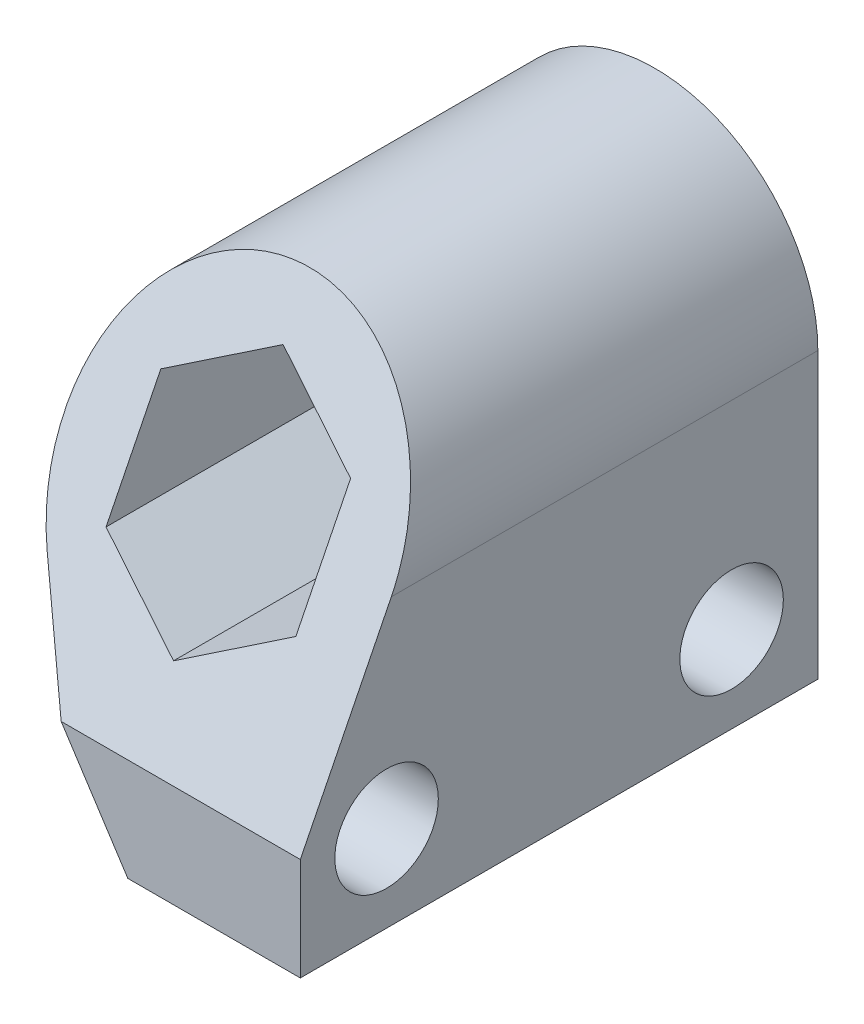
ISO-10303-21;
HEADER;
FILE_DESCRIPTION(('STEP AP214'),'2;1');
FILE_NAME('part.step','',(''),(''),'','','');
FILE_SCHEMA(('AUTOMOTIVE_DESIGN { 1 0 10303 214 1 1 1 1 }'));
ENDSEC;
DATA;
#1=APPLICATION_CONTEXT('core data for automotive mechanical design processes');
#2=APPLICATION_PROTOCOL_DEFINITION('international standard','automotive_design',2000,#1);
#3=PRODUCT_CONTEXT('',#1,'mechanical');
#4=PRODUCT('Part','Part','',(#3));
#5=PRODUCT_RELATED_PRODUCT_CATEGORY('part','',(#4));
#6=PRODUCT_DEFINITION_FORMATION('','',#4);
#7=PRODUCT_DEFINITION_CONTEXT('part definition',#1,'design');
#8=PRODUCT_DEFINITION('design','',#6,#7);
#9=PRODUCT_DEFINITION_SHAPE('','',#8);
#10=(LENGTH_UNIT() NAMED_UNIT(*) SI_UNIT(.MILLI.,.METRE.));
#11=(NAMED_UNIT(*) PLANE_ANGLE_UNIT() SI_UNIT($,.RADIAN.));
#12=(NAMED_UNIT(*) SI_UNIT($,.STERADIAN.) SOLID_ANGLE_UNIT());
#13=UNCERTAINTY_MEASURE_WITH_UNIT(LENGTH_MEASURE(1.E-05),#10,'distance_accuracy_value','');
#14=(GEOMETRIC_REPRESENTATION_CONTEXT(3) GLOBAL_UNCERTAINTY_ASSIGNED_CONTEXT((#13)) GLOBAL_UNIT_ASSIGNED_CONTEXT((#10,
#11,#12)) REPRESENTATION_CONTEXT('',''));
#15=CARTESIAN_POINT('',(0.,0.,0.));
#16=DIRECTION('',(0.,0.,1.));
#17=DIRECTION('',(1.,0.,0.));
#18=AXIS2_PLACEMENT_3D('',#15,#16,#17);
#19=CARTESIAN_POINT('',(0.,0.,9.525));
#20=DIRECTION('',(0.,0.,1.));
#21=DIRECTION('',(1.,0.,0.));
#22=AXIS2_PLACEMENT_3D('',#19,#20,#21);
#23=PLANE('',#22);
#24=DIRECTION('',(1.,0.,0.));
#25=VECTOR('',#24,1.);
#26=CARTESIAN_POINT('',(-6.00000000000005,-6.69999999999995,9.525));
#27=LINE('',#26,#25);
#28=CARTESIAN_POINT('',(-2.8031433131413,-6.69999999999995,9.525));
#29=VERTEX_POINT('',#28);
#30=CARTESIAN_POINT('',(6.00000000000005,-6.69999999999995,9.525));
#31=VERTEX_POINT('',#30);
#32=EDGE_CURVE('E54',#29,#31,#27,.T.);
#33=ORIENTED_EDGE('',*,*,#32,.F.);
#34=DIRECTION('',(0.544639992249275,-0.838669946309458,0.));
#35=VECTOR('',#34,1.);
#36=CARTESIAN_POINT('',(-0.34999999999995,-10.4775,9.525));
#37=LINE('',#36,#35);
#38=CARTESIAN_POINT('',(-0.34999999999995,-10.4775,9.525));
#39=VERTEX_POINT('',#38);
#40=EDGE_CURVE('E129',#29,#39,#37,.T.);
#41=ORIENTED_EDGE('',*,*,#40,.T.);
#42=DIRECTION('',(1.,0.,0.));
#43=VECTOR('',#42,1.);
#44=CARTESIAN_POINT('',(6.00000000000005,-10.4775,9.525));
#45=LINE('',#44,#43);
#46=CARTESIAN_POINT('',(6.00000000000005,-10.4775,9.525));
#47=VERTEX_POINT('',#46);
#48=EDGE_CURVE('E140',#39,#47,#45,.T.);
#49=ORIENTED_EDGE('',*,*,#48,.T.);
#50=DIRECTION('',(0.,1.,0.));
#51=VECTOR('',#50,1.);
#52=CARTESIAN_POINT('',(6.00000000000005,0.,9.525));
#53=LINE('',#52,#51);
#54=EDGE_CURVE('E132',#47,#31,#53,.T.);
#55=ORIENTED_EDGE('',*,*,#54,.T.);
#56=EDGE_LOOP('',(#33,#41,#49,#55));
#57=FACE_BOUND('',#56,.T.);
#58=ADVANCED_FACE('F39',(#57),#23,.T.);
#59=CARTESIAN_POINT('',(0.,0.,-9.525));
#60=DIRECTION('',(0.,0.,1.));
#61=DIRECTION('',(1.,0.,0.));
#62=AXIS2_PLACEMENT_3D('',#59,#60,#61);
#63=PLANE('',#62);
#64=CARTESIAN_POINT('',(0.,0.,-9.525));
#65=DIRECTION('',(0.,0.,1.));
#66=DIRECTION('',(1.,0.,0.));
#67=AXIS2_PLACEMENT_3D('',#64,#65,#66);
#68=CIRCLE('',#67,6.00000000000005);
#69=CARTESIAN_POINT('',(6.00000000000005,0.,-9.525));
#70=VERTEX_POINT('',#69);
#71=CARTESIAN_POINT('',(-5.03201967785679,-3.26783995349568,-9.525));
#72=VERTEX_POINT('',#71);
#73=EDGE_CURVE('E153',#70,#72,#68,.T.);
#74=ORIENTED_EDGE('',*,*,#73,.F.);
#75=DIRECTION('',(0.,1.,0.));
#76=VECTOR('',#75,1.);
#77=CARTESIAN_POINT('',(6.00000000000005,0.,-9.525));
#78=LINE('',#77,#76);
#79=CARTESIAN_POINT('',(6.00000000000005,-10.4775,-9.525));
#80=VERTEX_POINT('',#79);
#81=EDGE_CURVE('E141',#80,#70,#78,.T.);
#82=ORIENTED_EDGE('',*,*,#81,.F.);
#83=DIRECTION('',(1.,0.,0.));
#84=VECTOR('',#83,1.);
#85=CARTESIAN_POINT('',(6.00000000000005,-10.4775,-9.525));
#86=LINE('',#85,#84);
#87=CARTESIAN_POINT('',(-0.34999999999995,-10.4775,-9.525));
#88=VERTEX_POINT('',#87);
#89=EDGE_CURVE('E145',#88,#80,#86,.T.);
#90=ORIENTED_EDGE('',*,*,#89,.F.);
#91=DIRECTION('',(0.544639992249275,-0.838669946309458,0.));
#92=VECTOR('',#91,1.);
#93=CARTESIAN_POINT('',(-0.34999999999995,-10.4775,-9.525));
#94=LINE('',#93,#92);
#95=EDGE_CURVE('E156',#72,#88,#94,.T.);
#96=ORIENTED_EDGE('',*,*,#95,.F.);
#97=EDGE_LOOP('',(#74,#82,#90,#96));
#98=FACE_BOUND('',#97,.T.);
#99=DIRECTION('',(0.866025403784439,0.5,0.));
#100=VECTOR('',#99,1.);
#101=CARTESIAN_POINT('',(0.,-4.03279163028954,-9.525));
#102=LINE('',#101,#100);
#103=CARTESIAN_POINT('',(0.,-4.03279163028954,-9.525));
#104=VERTEX_POINT('',#103);
#105=CARTESIAN_POINT('',(3.4925,-2.01639581514477,-9.525));
#106=VERTEX_POINT('',#105);
#107=EDGE_CURVE('E252',#104,#106,#102,.T.);
#108=ORIENTED_EDGE('',*,*,#107,.T.);
#109=DIRECTION('',(0.,1.,0.));
#110=VECTOR('',#109,1.);
#111=CARTESIAN_POINT('',(3.4925,-2.01639581514477,-9.525));
#112=LINE('',#111,#110);
#113=CARTESIAN_POINT('',(3.4925,2.01639581514477,-9.525));
#114=VERTEX_POINT('',#113);
#115=EDGE_CURVE('E255',#106,#114,#112,.T.);
#116=ORIENTED_EDGE('',*,*,#115,.T.);
#117=DIRECTION('',(-0.866025403784438,0.5,0.));
#118=VECTOR('',#117,1.);
#119=CARTESIAN_POINT('',(3.4925,2.01639581514477,-9.525));
#120=LINE('',#119,#118);
#121=CARTESIAN_POINT('',(0.,4.03279163028954,-9.525));
#122=VERTEX_POINT('',#121);
#123=EDGE_CURVE('E258',#114,#122,#120,.T.);
#124=ORIENTED_EDGE('',*,*,#123,.T.);
#125=DIRECTION('',(-0.866025403784439,-0.5,0.));
#126=VECTOR('',#125,1.);
#127=CARTESIAN_POINT('',(0.,4.03279163028954,-9.525));
#128=LINE('',#127,#126);
#129=CARTESIAN_POINT('',(-3.4925,2.01639581514477,-9.525));
#130=VERTEX_POINT('',#129);
#131=EDGE_CURVE('E261',#122,#130,#128,.T.);
#132=ORIENTED_EDGE('',*,*,#131,.T.);
#133=DIRECTION('',(0.,-1.,0.));
#134=VECTOR('',#133,1.);
#135=CARTESIAN_POINT('',(-3.4925,2.01639581514477,-9.525));
#136=LINE('',#135,#134);
#137=CARTESIAN_POINT('',(-3.4925,-2.01639581514477,-9.525));
#138=VERTEX_POINT('',#137);
#139=EDGE_CURVE('E264',#130,#138,#136,.T.);
#140=ORIENTED_EDGE('',*,*,#139,.T.);
#141=DIRECTION('',(0.866025403784438,-0.500000000000001,0.));
#142=VECTOR('',#141,1.);
#143=CARTESIAN_POINT('',(-3.4925,-2.01639581514477,-9.525));
#144=LINE('',#143,#142);
#145=EDGE_CURVE('E267',#138,#104,#144,.T.);
#146=ORIENTED_EDGE('',*,*,#145,.T.);
#147=EDGE_LOOP('',(#108,#116,#124,#132,#140,#146));
#148=FACE_BOUND('',#147,.T.);
#149=ADVANCED_FACE('F168',(#98,#148),#63,.F.);
#150=CARTESIAN_POINT('',(0.,0.,9.525));
#151=DIRECTION('',(0.,0.,-1.));
#152=DIRECTION('',(-1.,0.,0.));
#153=AXIS2_PLACEMENT_3D('',#150,#151,#152);
#154=CYLINDRICAL_SURFACE('',#153,6.00000000000005);
#155=DIRECTION('',(0.,0.,-1.));
#156=VECTOR('',#155,1.);
#157=CARTESIAN_POINT('',(-5.03201967785679,-3.26783995349568,9.525));
#158=LINE('',#157,#156);
#159=CARTESIAN_POINT('',(-5.03201967785679,-3.26783995349568,7.80891997674787));
#160=VERTEX_POINT('',#159);
#161=EDGE_CURVE('E47',#160,#72,#158,.T.);
#162=ORIENTED_EDGE('',*,*,#161,.F.);
#163=CARTESIAN_POINT('',(0.,0.,6.17500000000002));
#164=DIRECTION('',(0.,-0.447213595499958,-0.894427190999916));
#165=DIRECTION('',(0.,0.894427190999916,-0.447213595499958));
#166=AXIS2_PLACEMENT_3D('',#163,#164,#165);
#167=ELLIPSE('',#166,6.70820393249942,6.00000000000005);
#168=CARTESIAN_POINT('',(6.00000000000005,0.,6.17500000000002));
#169=VERTEX_POINT('',#168);
#170=EDGE_CURVE('E122',#160,#169,#167,.T.);
#171=ORIENTED_EDGE('',*,*,#170,.T.);
#172=DIRECTION('',(0.,0.,-1.));
#173=VECTOR('',#172,1.);
#174=CARTESIAN_POINT('',(6.00000000000005,0.,9.525));
#175=LINE('',#174,#173);
#176=EDGE_CURVE('E152',#169,#70,#175,.T.);
#177=ORIENTED_EDGE('',*,*,#176,.T.);
#178=ORIENTED_EDGE('',*,*,#73,.T.);
#179=EDGE_LOOP('',(#162,#171,#177,#178));
#180=FACE_BOUND('',#179,.T.);
#181=ADVANCED_FACE('F41',(#180),#154,.T.);
#182=CARTESIAN_POINT('',(-0.34999999999995,-10.4775,9.525));
#183=DIRECTION('',(0.838669946309458,0.544639992249276,0.));
#184=DIRECTION('',(-0.544639992249276,0.838669946309458,0.));
#185=AXIS2_PLACEMENT_3D('',#182,#183,#184);
#186=PLANE('',#185);
#187=CARTESIAN_POINT('',(-2.41187426054891,-7.3025,6.35));
#188=DIRECTION('',(0.838669946309458,0.544639992249276,0.));
#189=DIRECTION('',(0.544639992249276,-0.838669946309458,0.));
#190=AXIS2_PLACEMENT_3D('',#187,#188,#189);
#191=ELLIPSE('',#190,2.27145375649014,1.905);
#192=CARTESIAN_POINT('',(-1.17474970421953,-9.2075,6.35));
#193=VERTEX_POINT('',#192);
#194=EDGE_CURVE('E235',#193,#193,#191,.T.);
#195=ORIENTED_EDGE('',*,*,#194,.T.);
#196=EDGE_LOOP('',(#195));
#197=FACE_BOUND('',#196,.T.);
#198=CARTESIAN_POINT('',(-2.41187426054891,-7.3025,-6.35));
#199=DIRECTION('',(0.838669946309458,0.544639992249276,0.));
#200=DIRECTION('',(0.544639992249276,-0.838669946309458,0.));
#201=AXIS2_PLACEMENT_3D('',#198,#199,#200);
#202=ELLIPSE('',#201,2.27145375649014,1.905);
#203=CARTESIAN_POINT('',(-1.17474970421953,-9.2075,-6.35));
#204=VERTEX_POINT('',#203);
#205=EDGE_CURVE('E236',#204,#204,#202,.T.);
#206=ORIENTED_EDGE('',*,*,#205,.T.);
#207=EDGE_LOOP('',(#206));
#208=FACE_BOUND('',#207,.T.);
#209=ORIENTED_EDGE('',*,*,#40,.F.);
#210=DIRECTION('',(-0.502267499362135,0.773422192122521,-0.386711096061261));
#211=VECTOR('',#210,1.);
#212=CARTESIAN_POINT('',(-0.71685647419815,-9.91259198021164,11.1312959901058));
#213=LINE('',#212,#211);
#214=EDGE_CURVE('E120',#29,#160,#213,.T.);
#215=ORIENTED_EDGE('',*,*,#214,.T.);
#216=ORIENTED_EDGE('',*,*,#161,.T.);
#217=ORIENTED_EDGE('',*,*,#95,.T.);
#218=DIRECTION('',(0.,0.,-1.));
#219=VECTOR('',#218,1.);
#220=CARTESIAN_POINT('',(-0.34999999999995,-10.4775,9.525));
#221=LINE('',#220,#219);
#222=EDGE_CURVE('E138',#39,#88,#221,.T.);
#223=ORIENTED_EDGE('',*,*,#222,.F.);
#224=EDGE_LOOP('',(#209,#215,#216,#217,#223));
#225=FACE_BOUND('',#224,.T.);
#226=ADVANCED_FACE('F136',(#197,#208,#225),#186,.F.);
#227=CARTESIAN_POINT('',(6.00000000000005,-10.4775,9.525));
#228=DIRECTION('',(0.,1.,0.));
#229=DIRECTION('',(-1.,0.,0.));
#230=AXIS2_PLACEMENT_3D('',#227,#228,#229);
#231=PLANE('',#230);
#232=ORIENTED_EDGE('',*,*,#89,.T.);
#233=DIRECTION('',(0.,0.,-1.));
#234=VECTOR('',#233,1.);
#235=CARTESIAN_POINT('',(6.00000000000005,-10.4775,9.525));
#236=LINE('',#235,#234);
#237=EDGE_CURVE('E160',#47,#80,#236,.T.);
#238=ORIENTED_EDGE('',*,*,#237,.F.);
#239=ORIENTED_EDGE('',*,*,#48,.F.);
#240=ORIENTED_EDGE('',*,*,#222,.T.);
#241=EDGE_LOOP('',(#232,#238,#239,#240));
#242=FACE_BOUND('',#241,.T.);
#243=ADVANCED_FACE('F176',(#242),#231,.F.);
#244=CARTESIAN_POINT('',(6.00000000000005,0.,9.525));
#245=DIRECTION('',(-1.,0.,0.));
#246=DIRECTION('',(0.,-1.,0.));
#247=AXIS2_PLACEMENT_3D('',#244,#245,#246);
#248=PLANE('',#247);
#249=CARTESIAN_POINT('',(6.00000000000005,-7.3025,6.35));
#250=DIRECTION('',(1.,0.,0.));
#251=DIRECTION('',(0.,0.,-1.));
#252=AXIS2_PLACEMENT_3D('',#249,#250,#251);
#253=CIRCLE('',#252,1.905);
#254=CARTESIAN_POINT('',(6.00000000000005,-7.3025,4.445));
#255=VERTEX_POINT('',#254);
#256=EDGE_CURVE('E232',#255,#255,#253,.T.);
#257=ORIENTED_EDGE('',*,*,#256,.F.);
#258=EDGE_LOOP('',(#257));
#259=FACE_BOUND('',#258,.T.);
#260=CARTESIAN_POINT('',(6.00000000000005,-7.3025,-6.35));
#261=DIRECTION('',(1.,0.,0.));
#262=DIRECTION('',(0.,0.,-1.));
#263=AXIS2_PLACEMENT_3D('',#260,#261,#262);
#264=CIRCLE('',#263,1.905);
#265=CARTESIAN_POINT('',(6.00000000000005,-7.3025,-8.255));
#266=VERTEX_POINT('',#265);
#267=EDGE_CURVE('E294',#266,#266,#264,.T.);
#268=ORIENTED_EDGE('',*,*,#267,.F.);
#269=EDGE_LOOP('',(#268));
#270=FACE_BOUND('',#269,.T.);
#271=ORIENTED_EDGE('',*,*,#176,.F.);
#272=DIRECTION('',(0.,0.894427190999916,-0.447213595499958));
#273=VECTOR('',#272,1.);
#274=CARTESIAN_POINT('',(6.00000000000005,6.00000000000005,3.175));
#275=LINE('',#274,#273);
#276=EDGE_CURVE('E134',#31,#169,#275,.T.);
#277=ORIENTED_EDGE('',*,*,#276,.F.);
#278=ORIENTED_EDGE('',*,*,#54,.F.);
#279=ORIENTED_EDGE('',*,*,#237,.T.);
#280=ORIENTED_EDGE('',*,*,#81,.T.);
#281=EDGE_LOOP('',(#271,#277,#278,#279,#280));
#282=FACE_BOUND('',#281,.T.);
#283=ADVANCED_FACE('F173',(#259,#270,#282),#248,.F.);
#284=CARTESIAN_POINT('',(0.,-4.03279163028954,9.525));
#285=DIRECTION('',(-0.5,0.866025403784439,0.));
#286=DIRECTION('',(-0.866025403784439,-0.5,0.));
#287=AXIS2_PLACEMENT_3D('',#284,#285,#286);
#288=PLANE('',#287);
#289=DIRECTION('',(-0.840168050416806,-0.485071250072666,0.242535625036333));
#290=VECTOR('',#289,1.);
#291=CARTESIAN_POINT('',(-0.271749435924202,-4.1896862402725,8.26984312013628));
#292=LINE('',#291,#290);
#293=CARTESIAN_POINT('',(3.4925,-2.01639581514477,7.18319790757241));
#294=VERTEX_POINT('',#293);
#295=CARTESIAN_POINT('',(0.,-4.03279163028954,8.1913958151448));
#296=VERTEX_POINT('',#295);
#297=EDGE_CURVE('E61',#294,#296,#292,.T.);
#298=ORIENTED_EDGE('',*,*,#297,.F.);
#299=DIRECTION('',(0.,0.,-1.));
#300=VECTOR('',#299,1.);
#301=CARTESIAN_POINT('',(3.4925,-2.01639581514477,9.525));
#302=LINE('',#301,#300);
#303=EDGE_CURVE('E148',#294,#106,#302,.T.);
#304=ORIENTED_EDGE('',*,*,#303,.T.);
#305=ORIENTED_EDGE('',*,*,#107,.F.);
#306=DIRECTION('',(0.,0.,-1.));
#307=VECTOR('',#306,1.);
#308=CARTESIAN_POINT('',(0.,-4.03279163028954,9.525));
#309=LINE('',#308,#307);
#310=EDGE_CURVE('E270',#296,#104,#309,.T.);
#311=ORIENTED_EDGE('',*,*,#310,.F.);
#312=EDGE_LOOP('',(#298,#304,#305,#311));
#313=FACE_BOUND('',#312,.T.);
#314=ADVANCED_FACE('F184',(#313),#288,.T.);
#315=CARTESIAN_POINT('',(3.4925,-2.01639581514477,9.525));
#316=DIRECTION('',(-1.,0.,0.));
#317=DIRECTION('',(0.,0.,1.));
#318=AXIS2_PLACEMENT_3D('',#315,#316,#317);
#319=PLANE('',#318);
#320=DIRECTION('',(0.,-0.894427190999916,0.447213595499958));
#321=VECTOR('',#320,1.);
#322=CARTESIAN_POINT('',(3.4925,-2.95311665211581,7.65155832605793));
#323=LINE('',#322,#321);
#324=CARTESIAN_POINT('',(3.4925,2.01639581514477,5.16680209242764));
#325=VERTEX_POINT('',#324);
#326=EDGE_CURVE('E248',#325,#294,#323,.T.);
#327=ORIENTED_EDGE('',*,*,#326,.F.);
#328=DIRECTION('',(0.,0.,-1.));
#329=VECTOR('',#328,1.);
#330=CARTESIAN_POINT('',(3.4925,2.01639581514477,9.525));
#331=LINE('',#330,#329);
#332=EDGE_CURVE('E277',#325,#114,#331,.T.);
#333=ORIENTED_EDGE('',*,*,#332,.T.);
#334=ORIENTED_EDGE('',*,*,#115,.F.);
#335=ORIENTED_EDGE('',*,*,#303,.F.);
#336=EDGE_LOOP('',(#327,#333,#334,#335));
#337=FACE_BOUND('',#336,.T.);
#338=ADVANCED_FACE('F197',(#337),#319,.T.);
#339=CARTESIAN_POINT('',(3.4925,2.01639581514477,9.525));
#340=DIRECTION('',(-0.5,-0.866025403784438,0.));
#341=DIRECTION('',(0.866025403784438,-0.5,0.));
#342=AXIS2_PLACEMENT_3D('',#339,#340,#341);
#343=PLANE('',#342);
#344=DIRECTION('',(0.840168050416806,-0.485071250072666,0.242535625036333));
#345=VECTOR('',#344,1.);
#346=CARTESIAN_POINT('',(4.38057296533596,1.50366664954802,5.42316667522601));
#347=LINE('',#346,#345);
#348=CARTESIAN_POINT('',(0.,4.03279163028954,4.15860418485526));
#349=VERTEX_POINT('',#348);
#350=EDGE_CURVE('E246',#349,#325,#347,.T.);
#351=ORIENTED_EDGE('',*,*,#350,.F.);
#352=DIRECTION('',(0.,0.,-1.));
#353=VECTOR('',#352,1.);
#354=CARTESIAN_POINT('',(0.,4.03279163028954,9.525));
#355=LINE('',#354,#353);
#356=EDGE_CURVE('E276',#349,#122,#355,.T.);
#357=ORIENTED_EDGE('',*,*,#356,.T.);
#358=ORIENTED_EDGE('',*,*,#123,.F.);
#359=ORIENTED_EDGE('',*,*,#332,.F.);
#360=EDGE_LOOP('',(#351,#357,#358,#359));
#361=FACE_BOUND('',#360,.T.);
#362=ADVANCED_FACE('F201',(#361),#343,.T.);
#363=CARTESIAN_POINT('',(0.,4.03279163028954,9.525));
#364=DIRECTION('',(0.5,-0.866025403784439,0.));
#365=DIRECTION('',(0.866025403784439,0.5,0.));
#366=AXIS2_PLACEMENT_3D('',#363,#364,#365);
#367=PLANE('',#366);
#368=DIRECTION('',(0.840168050416806,0.485071250072666,-0.242535625036333));
#369=VECTOR('',#368,1.);
#370=CARTESIAN_POINT('',(-1.09351414180655,3.40145094615486,4.47427452692259));
#371=LINE('',#370,#369);
#372=CARTESIAN_POINT('',(-3.4925,2.01639581514477,5.16680209242764));
#373=VERTEX_POINT('',#372);
#374=EDGE_CURVE('E244',#373,#349,#371,.T.);
#375=ORIENTED_EDGE('',*,*,#374,.F.);
#376=DIRECTION('',(0.,0.,-1.));
#377=VECTOR('',#376,1.);
#378=CARTESIAN_POINT('',(-3.4925,2.01639581514477,9.525));
#379=LINE('',#378,#377);
#380=EDGE_CURVE('E274',#373,#130,#379,.T.);
#381=ORIENTED_EDGE('',*,*,#380,.T.);
#382=ORIENTED_EDGE('',*,*,#131,.F.);
#383=ORIENTED_EDGE('',*,*,#356,.F.);
#384=EDGE_LOOP('',(#375,#381,#382,#383));
#385=FACE_BOUND('',#384,.T.);
#386=ADVANCED_FACE('F205',(#385),#367,.T.);
#387=CARTESIAN_POINT('',(-3.4925,2.01639581514477,9.525));
#388=DIRECTION('',(1.,0.,0.));
#389=DIRECTION('',(0.,0.,-1.));
#390=AXIS2_PLACEMENT_3D('',#387,#388,#389);
#391=PLANE('',#390);
#392=DIRECTION('',(0.,0.894427190999916,-0.447213595499958));
#393=VECTOR('',#392,1.);
#394=CARTESIAN_POINT('',(-3.4925,0.273116652115827,6.03844167394211));
#395=LINE('',#394,#393);
#396=CARTESIAN_POINT('',(-3.4925,-2.01639581514477,7.18319790757241));
#397=VERTEX_POINT('',#396);
#398=EDGE_CURVE('E133',#397,#373,#395,.T.);
#399=ORIENTED_EDGE('',*,*,#398,.F.);
#400=DIRECTION('',(0.,0.,-1.));
#401=VECTOR('',#400,1.);
#402=CARTESIAN_POINT('',(-3.4925,-2.01639581514477,9.525));
#403=LINE('',#402,#401);
#404=EDGE_CURVE('E272',#397,#138,#403,.T.);
#405=ORIENTED_EDGE('',*,*,#404,.T.);
#406=ORIENTED_EDGE('',*,*,#139,.F.);
#407=ORIENTED_EDGE('',*,*,#380,.F.);
#408=EDGE_LOOP('',(#399,#405,#406,#407));
#409=FACE_BOUND('',#408,.T.);
#410=ADVANCED_FACE('F209',(#409),#391,.T.);
#411=CARTESIAN_POINT('',(-3.4925,-2.01639581514477,9.525));
#412=DIRECTION('',(0.500000000000001,0.866025403784438,0.));
#413=DIRECTION('',(-0.866025403784438,0.500000000000001,0.));
#414=AXIS2_PLACEMENT_3D('',#411,#412,#413);
#415=PLANE('',#414);
#416=DIRECTION('',(-0.840168050416805,0.485071250072666,-0.242535625036333));
#417=VECTOR('',#416,1.);
#418=CARTESIAN_POINT('',(-3.01530938760521,-2.29190194366566,7.32095097183286));
#419=LINE('',#418,#417);
#420=EDGE_CURVE('E11',#296,#397,#419,.T.);
#421=ORIENTED_EDGE('',*,*,#420,.F.);
#422=ORIENTED_EDGE('',*,*,#310,.T.);
#423=ORIENTED_EDGE('',*,*,#145,.F.);
#424=ORIENTED_EDGE('',*,*,#404,.F.);
#425=EDGE_LOOP('',(#421,#422,#423,#424));
#426=FACE_BOUND('',#425,.T.);
#427=ADVANCED_FACE('F213',(#426),#415,.T.);
#428=CARTESIAN_POINT('',(-6.00000000000005,6.00000000000005,3.175));
#429=DIRECTION('',(0.,-0.447213595499958,-0.894427190999916));
#430=DIRECTION('',(0.,0.894427190999916,-0.447213595499958));
#431=AXIS2_PLACEMENT_3D('',#428,#429,#430);
#432=PLANE('',#431);
#433=ORIENTED_EDGE('',*,*,#297,.T.);
#434=ORIENTED_EDGE('',*,*,#420,.T.);
#435=ORIENTED_EDGE('',*,*,#398,.T.);
#436=ORIENTED_EDGE('',*,*,#374,.T.);
#437=ORIENTED_EDGE('',*,*,#350,.T.);
#438=ORIENTED_EDGE('',*,*,#326,.T.);
#439=EDGE_LOOP('',(#433,#434,#435,#436,#437,#438));
#440=FACE_BOUND('',#439,.T.);
#441=ORIENTED_EDGE('',*,*,#170,.F.);
#442=ORIENTED_EDGE('',*,*,#214,.F.);
#443=ORIENTED_EDGE('',*,*,#32,.T.);
#444=ORIENTED_EDGE('',*,*,#276,.T.);
#445=EDGE_LOOP('',(#441,#442,#443,#444));
#446=FACE_BOUND('',#445,.T.);
#447=ADVANCED_FACE('F121',(#440,#446),#432,.F.);
#448=CARTESIAN_POINT('',(-6.00000000000005,-7.3025,-6.35));
#449=DIRECTION('',(1.,0.,0.));
#450=DIRECTION('',(0.,0.,-1.));
#451=AXIS2_PLACEMENT_3D('',#448,#449,#450);
#452=CYLINDRICAL_SURFACE('',#451,1.905);
#453=ORIENTED_EDGE('',*,*,#267,.T.);
#454=EDGE_LOOP('',(#453));
#455=FACE_BOUND('',#454,.T.);
#456=ORIENTED_EDGE('',*,*,#205,.F.);
#457=EDGE_LOOP('',(#456));
#458=FACE_BOUND('',#457,.T.);
#459=ADVANCED_FACE('F220',(#455,#458),#452,.F.);
#460=CARTESIAN_POINT('',(-6.00000000000005,-7.3025,6.35));
#461=DIRECTION('',(1.,0.,0.));
#462=DIRECTION('',(0.,0.,-1.));
#463=AXIS2_PLACEMENT_3D('',#460,#461,#462);
#464=CYLINDRICAL_SURFACE('',#463,1.905);
#465=ORIENTED_EDGE('',*,*,#256,.T.);
#466=EDGE_LOOP('',(#465));
#467=FACE_BOUND('',#466,.T.);
#468=ORIENTED_EDGE('',*,*,#194,.F.);
#469=EDGE_LOOP('',(#468));
#470=FACE_BOUND('',#469,.T.);
#471=ADVANCED_FACE('F223',(#467,#470),#464,.F.);
#472=CLOSED_SHELL('',(#58,#149,#181,#226,#243,#283,#314,#338,#362,#386,#410,#427,#447,#459,#471));
#473=MANIFOLD_SOLID_BREP('B2',#472);
#474=ADVANCED_BREP_SHAPE_REPRESENTATION('',(#18,#473),#14);
#475=SHAPE_DEFINITION_REPRESENTATION(#9,#474);
ENDSEC;
END-ISO-10303-21;
